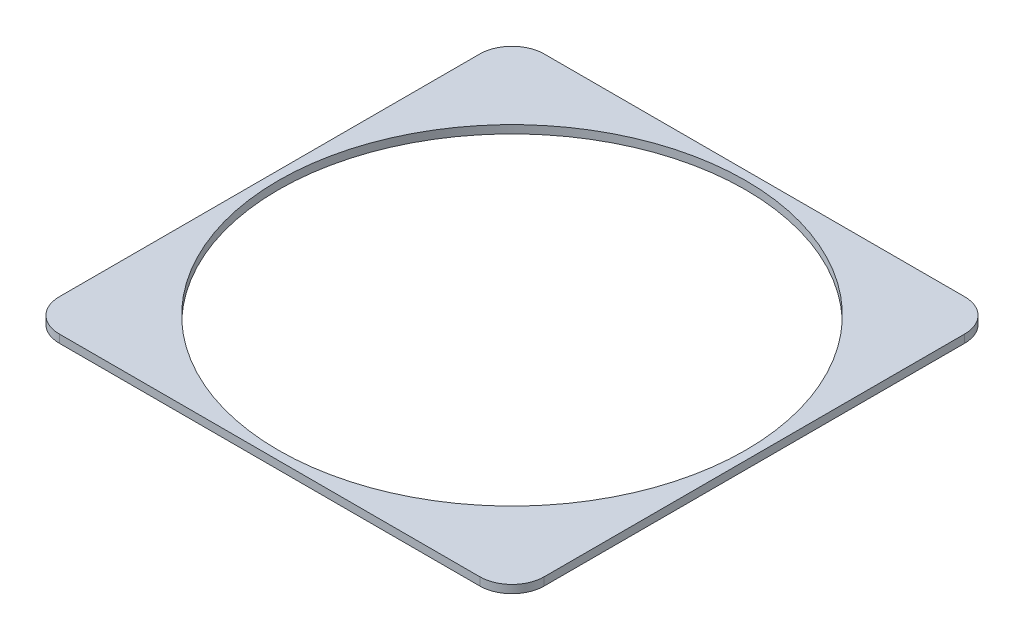
ISO-10303-21;
HEADER;
FILE_DESCRIPTION(('STEP AP214'),'2;1');
FILE_NAME('part.step','',(''),(''),'','','');
FILE_SCHEMA(('AUTOMOTIVE_DESIGN { 1 0 10303 214 1 1 1 1 }'));
ENDSEC;
DATA;
#1=APPLICATION_CONTEXT('core data for automotive mechanical design processes');
#2=APPLICATION_PROTOCOL_DEFINITION('international standard','automotive_design',2000,#1);
#3=PRODUCT_CONTEXT('',#1,'mechanical');
#4=PRODUCT('Part','Part','',(#3));
#5=PRODUCT_RELATED_PRODUCT_CATEGORY('part','',(#4));
#6=PRODUCT_DEFINITION_FORMATION('','',#4);
#7=PRODUCT_DEFINITION_CONTEXT('part definition',#1,'design');
#8=PRODUCT_DEFINITION('design','',#6,#7);
#9=PRODUCT_DEFINITION_SHAPE('','',#8);
#10=(LENGTH_UNIT() NAMED_UNIT(*) SI_UNIT(.MILLI.,.METRE.));
#11=(NAMED_UNIT(*) PLANE_ANGLE_UNIT() SI_UNIT($,.RADIAN.));
#12=(NAMED_UNIT(*) SI_UNIT($,.STERADIAN.) SOLID_ANGLE_UNIT());
#13=UNCERTAINTY_MEASURE_WITH_UNIT(LENGTH_MEASURE(1.E-05),#10,'distance_accuracy_value','');
#14=(GEOMETRIC_REPRESENTATION_CONTEXT(3) GLOBAL_UNCERTAINTY_ASSIGNED_CONTEXT((#13)) GLOBAL_UNIT_ASSIGNED_CONTEXT((#10,
#11,#12)) REPRESENTATION_CONTEXT('',''));
#15=CARTESIAN_POINT('',(0.,0.,0.));
#16=DIRECTION('',(0.,0.,1.));
#17=DIRECTION('',(1.,0.,0.));
#18=AXIS2_PLACEMENT_3D('',#15,#16,#17);
#19=CARTESIAN_POINT('',(0.,2.5,0.));
#20=DIRECTION('',(0.,-1.,0.));
#21=DIRECTION('',(0.,0.,-1.));
#22=AXIS2_PLACEMENT_3D('',#19,#20,#21);
#23=PLANE('',#22);
#24=DIRECTION('',(0.,0.,-1.));
#25=VECTOR('',#24,1.);
#26=CARTESIAN_POINT('',(75.25,2.5,75.25));
#27=LINE('',#26,#25);
#28=CARTESIAN_POINT('',(75.25,2.5,65.25));
#29=VERTEX_POINT('',#28);
#30=CARTESIAN_POINT('',(75.25,2.5,-65.25));
#31=VERTEX_POINT('',#30);
#32=EDGE_CURVE('E139',#29,#31,#27,.T.);
#33=ORIENTED_EDGE('',*,*,#32,.T.);
#34=CARTESIAN_POINT('',(65.25,2.5,-65.25));
#35=DIRECTION('',(0.,-1.,0.));
#36=DIRECTION('',(0.,0.,-1.));
#37=AXIS2_PLACEMENT_3D('',#34,#35,#36);
#38=CIRCLE('',#37,10.);
#39=CARTESIAN_POINT('',(65.25,2.5,-75.25));
#40=VERTEX_POINT('',#39);
#41=EDGE_CURVE('E154',#31,#40,#38,.F.);
#42=ORIENTED_EDGE('',*,*,#41,.T.);
#43=DIRECTION('',(-1.,0.,0.));
#44=VECTOR('',#43,1.);
#45=CARTESIAN_POINT('',(-75.25,2.5,-75.25));
#46=LINE('',#45,#44);
#47=CARTESIAN_POINT('',(-65.25,2.5,-75.25));
#48=VERTEX_POINT('',#47);
#49=EDGE_CURVE('E121',#40,#48,#46,.T.);
#50=ORIENTED_EDGE('',*,*,#49,.T.);
#51=CARTESIAN_POINT('',(-65.25,2.5,-65.25));
#52=DIRECTION('',(0.,-1.,0.));
#53=DIRECTION('',(0.,0.,-1.));
#54=AXIS2_PLACEMENT_3D('',#51,#52,#53);
#55=CIRCLE('',#54,10.);
#56=CARTESIAN_POINT('',(-75.25,2.5,-65.25));
#57=VERTEX_POINT('',#56);
#58=EDGE_CURVE('E149',#48,#57,#55,.F.);
#59=ORIENTED_EDGE('',*,*,#58,.T.);
#60=DIRECTION('',(0.,0.,1.));
#61=VECTOR('',#60,1.);
#62=CARTESIAN_POINT('',(-75.25,2.5,75.25));
#63=LINE('',#62,#61);
#64=CARTESIAN_POINT('',(-75.25,2.5,65.25));
#65=VERTEX_POINT('',#64);
#66=EDGE_CURVE('E165',#57,#65,#63,.T.);
#67=ORIENTED_EDGE('',*,*,#66,.T.);
#68=CARTESIAN_POINT('',(-65.25,2.5,65.25));
#69=DIRECTION('',(0.,-1.,0.));
#70=DIRECTION('',(0.,0.,-1.));
#71=AXIS2_PLACEMENT_3D('',#68,#69,#70);
#72=CIRCLE('',#71,10.);
#73=CARTESIAN_POINT('',(-65.25,2.5,75.25));
#74=VERTEX_POINT('',#73);
#75=EDGE_CURVE('E57',#65,#74,#72,.F.);
#76=ORIENTED_EDGE('',*,*,#75,.T.);
#77=DIRECTION('',(1.,0.,0.));
#78=VECTOR('',#77,1.);
#79=CARTESIAN_POINT('',(-75.25,2.5,75.25));
#80=LINE('',#79,#78);
#81=CARTESIAN_POINT('',(65.25,2.5,75.25));
#82=VERTEX_POINT('',#81);
#83=EDGE_CURVE('E140',#74,#82,#80,.T.);
#84=ORIENTED_EDGE('',*,*,#83,.T.);
#85=CARTESIAN_POINT('',(65.25,2.5,65.25));
#86=DIRECTION('',(0.,-1.,0.));
#87=DIRECTION('',(0.,0.,-1.));
#88=AXIS2_PLACEMENT_3D('',#85,#86,#87);
#89=CIRCLE('',#88,10.);
#90=EDGE_CURVE('E152',#82,#29,#89,.F.);
#91=ORIENTED_EDGE('',*,*,#90,.T.);
#92=EDGE_LOOP('',(#33,#42,#50,#59,#67,#76,#84,#91));
#93=FACE_BOUND('',#92,.T.);
#94=CARTESIAN_POINT('',(0.,2.5,0.));
#95=DIRECTION('',(0.,1.,0.));
#96=DIRECTION('',(0.,0.,1.));
#97=AXIS2_PLACEMENT_3D('',#94,#95,#96);
#98=CIRCLE('',#97,72.5);
#99=CARTESIAN_POINT('',(0.,2.5,72.5));
#100=VERTEX_POINT('',#99);
#101=EDGE_CURVE('E134',#100,#100,#98,.T.);
#102=ORIENTED_EDGE('',*,*,#101,.F.);
#103=EDGE_LOOP('',(#102));
#104=FACE_BOUND('',#103,.T.);
#105=ADVANCED_FACE('F35',(#93,#104),#23,.F.);
#106=CARTESIAN_POINT('',(0.,0.,0.));
#107=DIRECTION('',(0.,-1.,0.));
#108=DIRECTION('',(0.,0.,-1.));
#109=AXIS2_PLACEMENT_3D('',#106,#107,#108);
#110=PLANE('',#109);
#111=DIRECTION('',(-1.,0.,0.));
#112=VECTOR('',#111,1.);
#113=CARTESIAN_POINT('',(-75.25,0.,-75.25));
#114=LINE('',#113,#112);
#115=CARTESIAN_POINT('',(65.25,0.,-75.25));
#116=VERTEX_POINT('',#115);
#117=CARTESIAN_POINT('',(-65.25,0.,-75.25));
#118=VERTEX_POINT('',#117);
#119=EDGE_CURVE('E118',#116,#118,#114,.T.);
#120=ORIENTED_EDGE('',*,*,#119,.F.);
#121=CARTESIAN_POINT('',(65.25,0.,-65.25));
#122=DIRECTION('',(0.,-1.,0.));
#123=DIRECTION('',(0.,0.,-1.));
#124=AXIS2_PLACEMENT_3D('',#121,#122,#123);
#125=CIRCLE('',#124,10.);
#126=CARTESIAN_POINT('',(75.25,0.,-65.25));
#127=VERTEX_POINT('',#126);
#128=EDGE_CURVE('E101',#116,#127,#125,.T.);
#129=ORIENTED_EDGE('',*,*,#128,.T.);
#130=DIRECTION('',(0.,0.,-1.));
#131=VECTOR('',#130,1.);
#132=CARTESIAN_POINT('',(75.25,0.,75.25));
#133=LINE('',#132,#131);
#134=CARTESIAN_POINT('',(75.25,0.,65.25));
#135=VERTEX_POINT('',#134);
#136=EDGE_CURVE('E129',#135,#127,#133,.T.);
#137=ORIENTED_EDGE('',*,*,#136,.F.);
#138=CARTESIAN_POINT('',(65.25,0.,65.25));
#139=DIRECTION('',(0.,-1.,0.));
#140=DIRECTION('',(0.,0.,-1.));
#141=AXIS2_PLACEMENT_3D('',#138,#139,#140);
#142=CIRCLE('',#141,10.);
#143=CARTESIAN_POINT('',(65.25,0.,75.25));
#144=VERTEX_POINT('',#143);
#145=EDGE_CURVE('E112',#135,#144,#142,.T.);
#146=ORIENTED_EDGE('',*,*,#145,.T.);
#147=DIRECTION('',(1.,0.,0.));
#148=VECTOR('',#147,1.);
#149=CARTESIAN_POINT('',(-75.25,0.,75.25));
#150=LINE('',#149,#148);
#151=CARTESIAN_POINT('',(-65.25,0.,75.25));
#152=VERTEX_POINT('',#151);
#153=EDGE_CURVE('E132',#152,#144,#150,.T.);
#154=ORIENTED_EDGE('',*,*,#153,.F.);
#155=CARTESIAN_POINT('',(-65.25,0.,65.25));
#156=DIRECTION('',(0.,-1.,0.));
#157=DIRECTION('',(0.,0.,-1.));
#158=AXIS2_PLACEMENT_3D('',#155,#156,#157);
#159=CIRCLE('',#158,10.);
#160=CARTESIAN_POINT('',(-75.25,0.,65.25));
#161=VERTEX_POINT('',#160);
#162=EDGE_CURVE('E143',#152,#161,#159,.T.);
#163=ORIENTED_EDGE('',*,*,#162,.T.);
#164=DIRECTION('',(0.,0.,1.));
#165=VECTOR('',#164,1.);
#166=CARTESIAN_POINT('',(-75.25,0.,75.25));
#167=LINE('',#166,#165);
#168=CARTESIAN_POINT('',(-75.25,0.,-65.25));
#169=VERTEX_POINT('',#168);
#170=EDGE_CURVE('E128',#169,#161,#167,.T.);
#171=ORIENTED_EDGE('',*,*,#170,.F.);
#172=CARTESIAN_POINT('',(-65.25,0.,-65.25));
#173=DIRECTION('',(0.,-1.,0.));
#174=DIRECTION('',(0.,0.,-1.));
#175=AXIS2_PLACEMENT_3D('',#172,#173,#174);
#176=CIRCLE('',#175,10.);
#177=EDGE_CURVE('E122',#169,#118,#176,.T.);
#178=ORIENTED_EDGE('',*,*,#177,.T.);
#179=EDGE_LOOP('',(#120,#129,#137,#146,#154,#163,#171,#178));
#180=FACE_BOUND('',#179,.T.);
#181=CARTESIAN_POINT('',(0.,0.,0.));
#182=DIRECTION('',(0.,1.,0.));
#183=DIRECTION('',(0.,0.,1.));
#184=AXIS2_PLACEMENT_3D('',#181,#182,#183);
#185=CIRCLE('',#184,72.5);
#186=CARTESIAN_POINT('',(0.,0.,72.5));
#187=VERTEX_POINT('',#186);
#188=EDGE_CURVE('E179',#187,#187,#185,.T.);
#189=ORIENTED_EDGE('',*,*,#188,.T.);
#190=EDGE_LOOP('',(#189));
#191=FACE_BOUND('',#190,.T.);
#192=ADVANCED_FACE('F125',(#180,#191),#110,.T.);
#193=CARTESIAN_POINT('',(75.25,2.5,75.25));
#194=DIRECTION('',(-1.,0.,0.));
#195=DIRECTION('',(0.,0.,1.));
#196=AXIS2_PLACEMENT_3D('',#193,#194,#195);
#197=PLANE('',#196);
#198=ORIENTED_EDGE('',*,*,#136,.T.);
#199=DIRECTION('',(0.,-1.,0.));
#200=VECTOR('',#199,1.);
#201=CARTESIAN_POINT('',(75.25,2.5,-65.25));
#202=LINE('',#201,#200);
#203=EDGE_CURVE('E106',#127,#31,#202,.F.);
#204=ORIENTED_EDGE('',*,*,#203,.T.);
#205=ORIENTED_EDGE('',*,*,#32,.F.);
#206=DIRECTION('',(0.,-1.,0.));
#207=VECTOR('',#206,1.);
#208=CARTESIAN_POINT('',(75.25,2.5,65.25));
#209=LINE('',#208,#207);
#210=EDGE_CURVE('E111',#29,#135,#209,.T.);
#211=ORIENTED_EDGE('',*,*,#210,.T.);
#212=EDGE_LOOP('',(#198,#204,#205,#211));
#213=FACE_BOUND('',#212,.T.);
#214=ADVANCED_FACE('F193',(#213),#197,.F.);
#215=CARTESIAN_POINT('',(-75.25,2.5,-75.25));
#216=DIRECTION('',(0.,0.,1.));
#217=DIRECTION('',(1.,0.,0.));
#218=AXIS2_PLACEMENT_3D('',#215,#216,#217);
#219=PLANE('',#218);
#220=ORIENTED_EDGE('',*,*,#49,.F.);
#221=DIRECTION('',(0.,-1.,0.));
#222=VECTOR('',#221,1.);
#223=CARTESIAN_POINT('',(65.25,2.5,-75.25));
#224=LINE('',#223,#222);
#225=EDGE_CURVE('E105',#40,#116,#224,.T.);
#226=ORIENTED_EDGE('',*,*,#225,.T.);
#227=ORIENTED_EDGE('',*,*,#119,.T.);
#228=DIRECTION('',(0.,-1.,0.));
#229=VECTOR('',#228,1.);
#230=CARTESIAN_POINT('',(-65.25,2.5,-75.25));
#231=LINE('',#230,#229);
#232=EDGE_CURVE('E123',#118,#48,#231,.F.);
#233=ORIENTED_EDGE('',*,*,#232,.T.);
#234=EDGE_LOOP('',(#220,#226,#227,#233));
#235=FACE_BOUND('',#234,.T.);
#236=ADVANCED_FACE('F117',(#235),#219,.F.);
#237=CARTESIAN_POINT('',(-75.25,2.5,75.25));
#238=DIRECTION('',(1.,0.,0.));
#239=DIRECTION('',(0.,0.,-1.));
#240=AXIS2_PLACEMENT_3D('',#237,#238,#239);
#241=PLANE('',#240);
#242=ORIENTED_EDGE('',*,*,#170,.T.);
#243=DIRECTION('',(0.,-1.,0.));
#244=VECTOR('',#243,1.);
#245=CARTESIAN_POINT('',(-75.25,2.5,65.25));
#246=LINE('',#245,#244);
#247=EDGE_CURVE('E11',#161,#65,#246,.F.);
#248=ORIENTED_EDGE('',*,*,#247,.T.);
#249=ORIENTED_EDGE('',*,*,#66,.F.);
#250=DIRECTION('',(0.,-1.,0.));
#251=VECTOR('',#250,1.);
#252=CARTESIAN_POINT('',(-75.25,2.5,-65.25));
#253=LINE('',#252,#251);
#254=EDGE_CURVE('E43',#57,#169,#253,.T.);
#255=ORIENTED_EDGE('',*,*,#254,.T.);
#256=EDGE_LOOP('',(#242,#248,#249,#255));
#257=FACE_BOUND('',#256,.T.);
#258=ADVANCED_FACE('F163',(#257),#241,.F.);
#259=CARTESIAN_POINT('',(-75.25,2.5,75.25));
#260=DIRECTION('',(0.,0.,-1.));
#261=DIRECTION('',(-1.,0.,0.));
#262=AXIS2_PLACEMENT_3D('',#259,#260,#261);
#263=PLANE('',#262);
#264=ORIENTED_EDGE('',*,*,#153,.T.);
#265=DIRECTION('',(0.,-1.,0.));
#266=VECTOR('',#265,1.);
#267=CARTESIAN_POINT('',(65.25,2.5,75.25));
#268=LINE('',#267,#266);
#269=EDGE_CURVE('E50',#144,#82,#268,.F.);
#270=ORIENTED_EDGE('',*,*,#269,.T.);
#271=ORIENTED_EDGE('',*,*,#83,.F.);
#272=DIRECTION('',(0.,-1.,0.));
#273=VECTOR('',#272,1.);
#274=CARTESIAN_POINT('',(-65.25,2.5,75.25));
#275=LINE('',#274,#273);
#276=EDGE_CURVE('E156',#74,#152,#275,.T.);
#277=ORIENTED_EDGE('',*,*,#276,.T.);
#278=EDGE_LOOP('',(#264,#270,#271,#277));
#279=FACE_BOUND('',#278,.T.);
#280=ADVANCED_FACE('F172',(#279),#263,.F.);
#281=CARTESIAN_POINT('',(0.,2.5,0.));
#282=DIRECTION('',(0.,-1.,0.));
#283=DIRECTION('',(0.,0.,-1.));
#284=AXIS2_PLACEMENT_3D('',#281,#282,#283);
#285=CYLINDRICAL_SURFACE('',#284,72.5);
#286=ORIENTED_EDGE('',*,*,#101,.T.);
#287=EDGE_LOOP('',(#286));
#288=FACE_BOUND('',#287,.T.);
#289=ORIENTED_EDGE('',*,*,#188,.F.);
#290=EDGE_LOOP('',(#289));
#291=FACE_BOUND('',#290,.T.);
#292=ADVANCED_FACE('F185',(#288,#291),#285,.F.);
#293=CARTESIAN_POINT('',(65.25,2.5,-65.25));
#294=DIRECTION('',(0.,-1.,0.));
#295=DIRECTION('',(0.,0.,-1.));
#296=AXIS2_PLACEMENT_3D('',#293,#294,#295);
#297=CYLINDRICAL_SURFACE('',#296,10.);
#298=ORIENTED_EDGE('',*,*,#41,.F.);
#299=ORIENTED_EDGE('',*,*,#203,.F.);
#300=ORIENTED_EDGE('',*,*,#128,.F.);
#301=ORIENTED_EDGE('',*,*,#225,.F.);
#302=EDGE_LOOP('',(#298,#299,#300,#301));
#303=FACE_BOUND('',#302,.T.);
#304=ADVANCED_FACE('F104',(#303),#297,.T.);
#305=CARTESIAN_POINT('',(65.25,2.5,65.25));
#306=DIRECTION('',(0.,-1.,0.));
#307=DIRECTION('',(0.,0.,-1.));
#308=AXIS2_PLACEMENT_3D('',#305,#306,#307);
#309=CYLINDRICAL_SURFACE('',#308,10.);
#310=ORIENTED_EDGE('',*,*,#90,.F.);
#311=ORIENTED_EDGE('',*,*,#269,.F.);
#312=ORIENTED_EDGE('',*,*,#145,.F.);
#313=ORIENTED_EDGE('',*,*,#210,.F.);
#314=EDGE_LOOP('',(#310,#311,#312,#313));
#315=FACE_BOUND('',#314,.T.);
#316=ADVANCED_FACE('F208',(#315),#309,.T.);
#317=CARTESIAN_POINT('',(-65.25,2.5,65.25));
#318=DIRECTION('',(0.,-1.,0.));
#319=DIRECTION('',(0.,0.,-1.));
#320=AXIS2_PLACEMENT_3D('',#317,#318,#319);
#321=CYLINDRICAL_SURFACE('',#320,10.);
#322=ORIENTED_EDGE('',*,*,#75,.F.);
#323=ORIENTED_EDGE('',*,*,#247,.F.);
#324=ORIENTED_EDGE('',*,*,#162,.F.);
#325=ORIENTED_EDGE('',*,*,#276,.F.);
#326=EDGE_LOOP('',(#322,#323,#324,#325));
#327=FACE_BOUND('',#326,.T.);
#328=ADVANCED_FACE('F171',(#327),#321,.T.);
#329=CARTESIAN_POINT('',(-65.25,2.5,-65.25));
#330=DIRECTION('',(0.,-1.,0.));
#331=DIRECTION('',(0.,0.,-1.));
#332=AXIS2_PLACEMENT_3D('',#329,#330,#331);
#333=CYLINDRICAL_SURFACE('',#332,10.);
#334=ORIENTED_EDGE('',*,*,#58,.F.);
#335=ORIENTED_EDGE('',*,*,#232,.F.);
#336=ORIENTED_EDGE('',*,*,#177,.F.);
#337=ORIENTED_EDGE('',*,*,#254,.F.);
#338=EDGE_LOOP('',(#334,#335,#336,#337));
#339=FACE_BOUND('',#338,.T.);
#340=ADVANCED_FACE('F37',(#339),#333,.T.);
#341=CLOSED_SHELL('',(#105,#192,#214,#236,#258,#280,#292,#304,#316,#328,#340));
#342=MANIFOLD_SOLID_BREP('B2',#341);
#343=ADVANCED_BREP_SHAPE_REPRESENTATION('',(#18,#342),#14);
#344=SHAPE_DEFINITION_REPRESENTATION(#9,#343);
ENDSEC;
END-ISO-10303-21;
